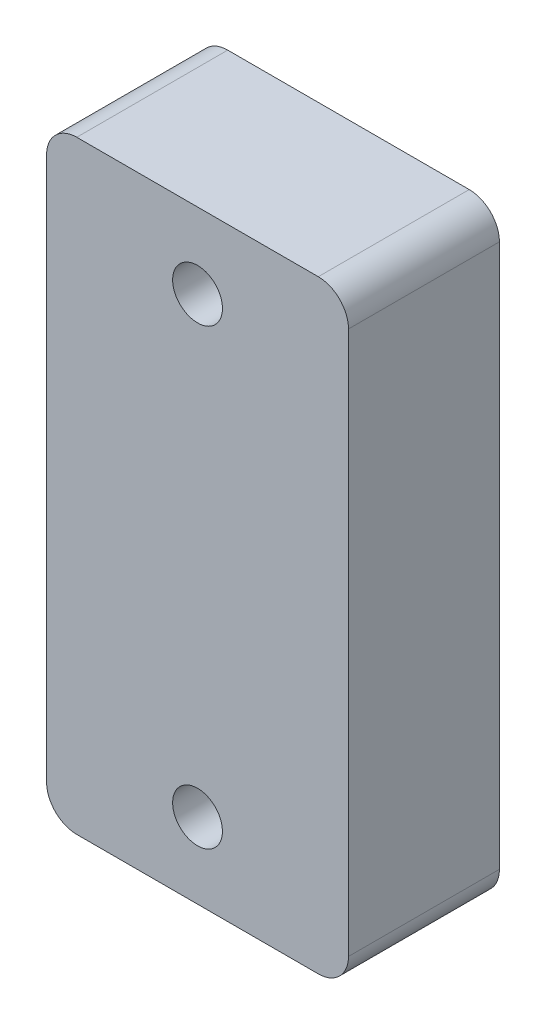
ISO-10303-21;
HEADER;
FILE_DESCRIPTION(('STEP AP214'),'2;1');
FILE_NAME('part.step','',(''),(''),'','','');
FILE_SCHEMA(('AUTOMOTIVE_DESIGN { 1 0 10303 214 1 1 1 1 }'));
ENDSEC;
DATA;
#1=APPLICATION_CONTEXT('core data for automotive mechanical design processes');
#2=APPLICATION_PROTOCOL_DEFINITION('international standard','automotive_design',2000,#1);
#3=PRODUCT_CONTEXT('',#1,'mechanical');
#4=PRODUCT('Part','Part','',(#3));
#5=PRODUCT_RELATED_PRODUCT_CATEGORY('part','',(#4));
#6=PRODUCT_DEFINITION_FORMATION('','',#4);
#7=PRODUCT_DEFINITION_CONTEXT('part definition',#1,'design');
#8=PRODUCT_DEFINITION('design','',#6,#7);
#9=PRODUCT_DEFINITION_SHAPE('','',#8);
#10=(LENGTH_UNIT() NAMED_UNIT(*) SI_UNIT(.MILLI.,.METRE.));
#11=(NAMED_UNIT(*) PLANE_ANGLE_UNIT() SI_UNIT($,.RADIAN.));
#12=(NAMED_UNIT(*) SI_UNIT($,.STERADIAN.) SOLID_ANGLE_UNIT());
#13=UNCERTAINTY_MEASURE_WITH_UNIT(LENGTH_MEASURE(1.E-05),#10,'distance_accuracy_value','');
#14=(GEOMETRIC_REPRESENTATION_CONTEXT(3) GLOBAL_UNCERTAINTY_ASSIGNED_CONTEXT((#13)) GLOBAL_UNIT_ASSIGNED_CONTEXT((#10,
#11,#12)) REPRESENTATION_CONTEXT('',''));
#15=CARTESIAN_POINT('',(0.,0.,0.));
#16=DIRECTION('',(0.,0.,1.));
#17=DIRECTION('',(1.,0.,0.));
#18=AXIS2_PLACEMENT_3D('',#15,#16,#17);
#19=CARTESIAN_POINT('',(0.,0.,10.));
#20=DIRECTION('',(0.,0.,1.));
#21=DIRECTION('',(1.,0.,0.));
#22=AXIS2_PLACEMENT_3D('',#19,#20,#21);
#23=PLANE('',#22);
#24=CARTESIAN_POINT('',(0.,15.,10.));
#25=DIRECTION('',(0.,0.,1.));
#26=DIRECTION('',(1.,0.,0.));
#27=AXIS2_PLACEMENT_3D('',#24,#25,#26);
#28=CIRCLE('',#27,1.65);
#29=CARTESIAN_POINT('',(1.65,15.,10.));
#30=VERTEX_POINT('',#29);
#31=EDGE_CURVE('E135',#30,#30,#28,.T.);
#32=ORIENTED_EDGE('',*,*,#31,.F.);
#33=EDGE_LOOP('',(#32));
#34=FACE_BOUND('',#33,.T.);
#35=DIRECTION('',(1.,0.,0.));
#36=VECTOR('',#35,1.);
#37=CARTESIAN_POINT('',(-9.99999999999999,-20.,10.));
#38=LINE('',#37,#36);
#39=CARTESIAN_POINT('',(-7.99999999999999,-20.,10.));
#40=VERTEX_POINT('',#39);
#41=CARTESIAN_POINT('',(8.00000000000001,-20.,10.));
#42=VERTEX_POINT('',#41);
#43=EDGE_CURVE('E144',#40,#42,#38,.T.);
#44=ORIENTED_EDGE('',*,*,#43,.T.);
#45=CARTESIAN_POINT('',(8.00000000000001,-18.,10.));
#46=DIRECTION('',(0.,0.,1.));
#47=DIRECTION('',(1.,0.,0.));
#48=AXIS2_PLACEMENT_3D('',#45,#46,#47);
#49=CIRCLE('',#48,2.);
#50=CARTESIAN_POINT('',(10.,-18.,10.));
#51=VERTEX_POINT('',#50);
#52=EDGE_CURVE('E163',#42,#51,#49,.T.);
#53=ORIENTED_EDGE('',*,*,#52,.T.);
#54=DIRECTION('',(0.,1.,0.));
#55=VECTOR('',#54,1.);
#56=CARTESIAN_POINT('',(10.,20.,10.));
#57=LINE('',#56,#55);
#58=CARTESIAN_POINT('',(10.,18.,10.));
#59=VERTEX_POINT('',#58);
#60=EDGE_CURVE('E127',#51,#59,#57,.T.);
#61=ORIENTED_EDGE('',*,*,#60,.T.);
#62=CARTESIAN_POINT('',(8.,18.,10.));
#63=DIRECTION('',(0.,0.,1.));
#64=DIRECTION('',(1.,0.,0.));
#65=AXIS2_PLACEMENT_3D('',#62,#63,#64);
#66=CIRCLE('',#65,2.);
#67=CARTESIAN_POINT('',(8.,20.,10.));
#68=VERTEX_POINT('',#67);
#69=EDGE_CURVE('E158',#59,#68,#66,.T.);
#70=ORIENTED_EDGE('',*,*,#69,.T.);
#71=DIRECTION('',(-1.,0.,0.));
#72=VECTOR('',#71,1.);
#73=CARTESIAN_POINT('',(-10.,20.,10.));
#74=LINE('',#73,#72);
#75=CARTESIAN_POINT('',(-8.,20.,10.));
#76=VERTEX_POINT('',#75);
#77=EDGE_CURVE('E174',#68,#76,#74,.T.);
#78=ORIENTED_EDGE('',*,*,#77,.T.);
#79=CARTESIAN_POINT('',(-8.,18.,10.));
#80=DIRECTION('',(0.,0.,1.));
#81=DIRECTION('',(1.,0.,0.));
#82=AXIS2_PLACEMENT_3D('',#79,#80,#81);
#83=CIRCLE('',#82,2.);
#84=CARTESIAN_POINT('',(-10.,18.,10.));
#85=VERTEX_POINT('',#84);
#86=EDGE_CURVE('E63',#76,#85,#83,.T.);
#87=ORIENTED_EDGE('',*,*,#86,.T.);
#88=DIRECTION('',(0.,-1.,0.));
#89=VECTOR('',#88,1.);
#90=CARTESIAN_POINT('',(-10.,20.,10.));
#91=LINE('',#90,#89);
#92=CARTESIAN_POINT('',(-9.99999999999999,-18.,10.));
#93=VERTEX_POINT('',#92);
#94=EDGE_CURVE('E182',#85,#93,#91,.T.);
#95=ORIENTED_EDGE('',*,*,#94,.T.);
#96=CARTESIAN_POINT('',(-7.99999999999999,-18.,10.));
#97=DIRECTION('',(0.,0.,1.));
#98=DIRECTION('',(1.,0.,0.));
#99=AXIS2_PLACEMENT_3D('',#96,#97,#98);
#100=CIRCLE('',#99,2.);
#101=EDGE_CURVE('E161',#93,#40,#100,.T.);
#102=ORIENTED_EDGE('',*,*,#101,.T.);
#103=EDGE_LOOP('',(#44,#53,#61,#70,#78,#87,#95,#102));
#104=FACE_BOUND('',#103,.T.);
#105=CARTESIAN_POINT('',(0.,-15.,10.));
#106=DIRECTION('',(0.,0.,1.));
#107=DIRECTION('',(-1.,0.,0.));
#108=AXIS2_PLACEMENT_3D('',#105,#106,#107);
#109=CIRCLE('',#108,1.65);
#110=CARTESIAN_POINT('',(-1.65,-15.,10.));
#111=VERTEX_POINT('',#110);
#112=EDGE_CURVE('E189',#111,#111,#109,.T.);
#113=ORIENTED_EDGE('',*,*,#112,.F.);
#114=EDGE_LOOP('',(#113));
#115=FACE_BOUND('',#114,.T.);
#116=ADVANCED_FACE('F41',(#34,#104,#115),#23,.T.);
#117=CARTESIAN_POINT('',(0.,0.,0.));
#118=DIRECTION('',(0.,0.,1.));
#119=DIRECTION('',(1.,0.,0.));
#120=AXIS2_PLACEMENT_3D('',#117,#118,#119);
#121=PLANE('',#120);
#122=DIRECTION('',(0.,1.,0.));
#123=VECTOR('',#122,1.);
#124=CARTESIAN_POINT('',(10.,20.,0.));
#125=LINE('',#124,#123);
#126=CARTESIAN_POINT('',(10.,-18.,0.));
#127=VERTEX_POINT('',#126);
#128=CARTESIAN_POINT('',(10.,18.,0.));
#129=VERTEX_POINT('',#128);
#130=EDGE_CURVE('E124',#127,#129,#125,.T.);
#131=ORIENTED_EDGE('',*,*,#130,.F.);
#132=CARTESIAN_POINT('',(8.00000000000001,-18.,0.));
#133=DIRECTION('',(0.,0.,1.));
#134=DIRECTION('',(1.,0.,0.));
#135=AXIS2_PLACEMENT_3D('',#132,#133,#134);
#136=CIRCLE('',#135,2.);
#137=CARTESIAN_POINT('',(8.00000000000001,-20.,0.));
#138=VERTEX_POINT('',#137);
#139=EDGE_CURVE('E107',#127,#138,#136,.F.);
#140=ORIENTED_EDGE('',*,*,#139,.T.);
#141=DIRECTION('',(1.,0.,0.));
#142=VECTOR('',#141,1.);
#143=CARTESIAN_POINT('',(-9.99999999999999,-20.,0.));
#144=LINE('',#143,#142);
#145=CARTESIAN_POINT('',(-7.99999999999999,-20.,0.));
#146=VERTEX_POINT('',#145);
#147=EDGE_CURVE('E148',#146,#138,#144,.T.);
#148=ORIENTED_EDGE('',*,*,#147,.F.);
#149=CARTESIAN_POINT('',(-7.99999999999999,-18.,0.));
#150=DIRECTION('',(0.,0.,1.));
#151=DIRECTION('',(1.,0.,0.));
#152=AXIS2_PLACEMENT_3D('',#149,#150,#151);
#153=CIRCLE('',#152,2.);
#154=CARTESIAN_POINT('',(-9.99999999999999,-18.,0.));
#155=VERTEX_POINT('',#154);
#156=EDGE_CURVE('E118',#146,#155,#153,.F.);
#157=ORIENTED_EDGE('',*,*,#156,.T.);
#158=DIRECTION('',(0.,-1.,0.));
#159=VECTOR('',#158,1.);
#160=CARTESIAN_POINT('',(-10.,20.,0.));
#161=LINE('',#160,#159);
#162=CARTESIAN_POINT('',(-10.,18.,0.));
#163=VERTEX_POINT('',#162);
#164=EDGE_CURVE('E138',#163,#155,#161,.T.);
#165=ORIENTED_EDGE('',*,*,#164,.F.);
#166=CARTESIAN_POINT('',(-8.,18.,0.));
#167=DIRECTION('',(0.,0.,1.));
#168=DIRECTION('',(1.,0.,0.));
#169=AXIS2_PLACEMENT_3D('',#166,#167,#168);
#170=CIRCLE('',#169,2.);
#171=CARTESIAN_POINT('',(-8.,20.,0.));
#172=VERTEX_POINT('',#171);
#173=EDGE_CURVE('E152',#163,#172,#170,.F.);
#174=ORIENTED_EDGE('',*,*,#173,.T.);
#175=DIRECTION('',(-1.,0.,0.));
#176=VECTOR('',#175,1.);
#177=CARTESIAN_POINT('',(-10.,20.,0.));
#178=LINE('',#177,#176);
#179=CARTESIAN_POINT('',(8.,20.,0.));
#180=VERTEX_POINT('',#179);
#181=EDGE_CURVE('E134',#180,#172,#178,.T.);
#182=ORIENTED_EDGE('',*,*,#181,.F.);
#183=CARTESIAN_POINT('',(8.,18.,0.));
#184=DIRECTION('',(0.,0.,1.));
#185=DIRECTION('',(1.,0.,0.));
#186=AXIS2_PLACEMENT_3D('',#183,#184,#185);
#187=CIRCLE('',#186,2.);
#188=EDGE_CURVE('E128',#180,#129,#187,.F.);
#189=ORIENTED_EDGE('',*,*,#188,.T.);
#190=EDGE_LOOP('',(#131,#140,#148,#157,#165,#174,#182,#189));
#191=FACE_BOUND('',#190,.T.);
#192=CARTESIAN_POINT('',(0.,15.,0.));
#193=DIRECTION('',(0.,0.,1.));
#194=DIRECTION('',(1.,0.,0.));
#195=AXIS2_PLACEMENT_3D('',#192,#193,#194);
#196=CIRCLE('',#195,1.65);
#197=CARTESIAN_POINT('',(1.65,15.,0.));
#198=VERTEX_POINT('',#197);
#199=EDGE_CURVE('E141',#198,#198,#196,.T.);
#200=ORIENTED_EDGE('',*,*,#199,.T.);
#201=EDGE_LOOP('',(#200));
#202=FACE_BOUND('',#201,.T.);
#203=CARTESIAN_POINT('',(0.,-15.,0.));
#204=DIRECTION('',(0.,0.,1.));
#205=DIRECTION('',(-1.,0.,0.));
#206=AXIS2_PLACEMENT_3D('',#203,#204,#205);
#207=CIRCLE('',#206,1.65);
#208=CARTESIAN_POINT('',(-1.65,-15.,0.));
#209=VERTEX_POINT('',#208);
#210=EDGE_CURVE('E191',#209,#209,#207,.T.);
#211=ORIENTED_EDGE('',*,*,#210,.T.);
#212=EDGE_LOOP('',(#211));
#213=FACE_BOUND('',#212,.T.);
#214=ADVANCED_FACE('F131',(#191,#202,#213),#121,.F.);
#215=CARTESIAN_POINT('',(10.,20.,10.));
#216=DIRECTION('',(-1.,0.,0.));
#217=DIRECTION('',(0.,-1.,0.));
#218=AXIS2_PLACEMENT_3D('',#215,#216,#217);
#219=PLANE('',#218);
#220=ORIENTED_EDGE('',*,*,#60,.F.);
#221=DIRECTION('',(0.,0.,-1.));
#222=VECTOR('',#221,1.);
#223=CARTESIAN_POINT('',(10.,-18.,10.));
#224=LINE('',#223,#222);
#225=EDGE_CURVE('E111',#51,#127,#224,.T.);
#226=ORIENTED_EDGE('',*,*,#225,.T.);
#227=ORIENTED_EDGE('',*,*,#130,.T.);
#228=DIRECTION('',(0.,0.,-1.));
#229=VECTOR('',#228,1.);
#230=CARTESIAN_POINT('',(10.,18.,10.));
#231=LINE('',#230,#229);
#232=EDGE_CURVE('E129',#129,#59,#231,.F.);
#233=ORIENTED_EDGE('',*,*,#232,.T.);
#234=EDGE_LOOP('',(#220,#226,#227,#233));
#235=FACE_BOUND('',#234,.T.);
#236=ADVANCED_FACE('F123',(#235),#219,.F.);
#237=CARTESIAN_POINT('',(-10.,20.,10.));
#238=DIRECTION('',(0.,-1.,0.));
#239=DIRECTION('',(0.,0.,-1.));
#240=AXIS2_PLACEMENT_3D('',#237,#238,#239);
#241=PLANE('',#240);
#242=ORIENTED_EDGE('',*,*,#181,.T.);
#243=DIRECTION('',(0.,0.,-1.));
#244=VECTOR('',#243,1.);
#245=CARTESIAN_POINT('',(-8.,20.,10.));
#246=LINE('',#245,#244);
#247=EDGE_CURVE('E11',#172,#76,#246,.F.);
#248=ORIENTED_EDGE('',*,*,#247,.T.);
#249=ORIENTED_EDGE('',*,*,#77,.F.);
#250=DIRECTION('',(0.,0.,-1.));
#251=VECTOR('',#250,1.);
#252=CARTESIAN_POINT('',(8.,20.,10.));
#253=LINE('',#252,#251);
#254=EDGE_CURVE('E49',#68,#180,#253,.T.);
#255=ORIENTED_EDGE('',*,*,#254,.T.);
#256=EDGE_LOOP('',(#242,#248,#249,#255));
#257=FACE_BOUND('',#256,.T.);
#258=ADVANCED_FACE('F172',(#257),#241,.F.);
#259=CARTESIAN_POINT('',(-10.,20.,10.));
#260=DIRECTION('',(1.,0.,0.));
#261=DIRECTION('',(0.,1.,0.));
#262=AXIS2_PLACEMENT_3D('',#259,#260,#261);
#263=PLANE('',#262);
#264=ORIENTED_EDGE('',*,*,#164,.T.);
#265=DIRECTION('',(0.,0.,-1.));
#266=VECTOR('',#265,1.);
#267=CARTESIAN_POINT('',(-9.99999999999999,-18.,10.));
#268=LINE('',#267,#266);
#269=EDGE_CURVE('E56',#155,#93,#268,.F.);
#270=ORIENTED_EDGE('',*,*,#269,.T.);
#271=ORIENTED_EDGE('',*,*,#94,.F.);
#272=DIRECTION('',(0.,0.,-1.));
#273=VECTOR('',#272,1.);
#274=CARTESIAN_POINT('',(-10.,18.,10.));
#275=LINE('',#274,#273);
#276=EDGE_CURVE('E165',#85,#163,#275,.T.);
#277=ORIENTED_EDGE('',*,*,#276,.T.);
#278=EDGE_LOOP('',(#264,#270,#271,#277));
#279=FACE_BOUND('',#278,.T.);
#280=ADVANCED_FACE('F181',(#279),#263,.F.);
#281=CARTESIAN_POINT('',(-9.99999999999999,-20.,10.));
#282=DIRECTION('',(0.,1.,0.));
#283=DIRECTION('',(0.,0.,1.));
#284=AXIS2_PLACEMENT_3D('',#281,#282,#283);
#285=PLANE('',#284);
#286=ORIENTED_EDGE('',*,*,#147,.T.);
#287=DIRECTION('',(0.,0.,-1.));
#288=VECTOR('',#287,1.);
#289=CARTESIAN_POINT('',(8.00000000000001,-20.,10.));
#290=LINE('',#289,#288);
#291=EDGE_CURVE('E112',#138,#42,#290,.F.);
#292=ORIENTED_EDGE('',*,*,#291,.T.);
#293=ORIENTED_EDGE('',*,*,#43,.F.);
#294=DIRECTION('',(0.,0.,-1.));
#295=VECTOR('',#294,1.);
#296=CARTESIAN_POINT('',(-7.99999999999999,-20.,10.));
#297=LINE('',#296,#295);
#298=EDGE_CURVE('E117',#40,#146,#297,.T.);
#299=ORIENTED_EDGE('',*,*,#298,.T.);
#300=EDGE_LOOP('',(#286,#292,#293,#299));
#301=FACE_BOUND('',#300,.T.);
#302=ADVANCED_FACE('F213',(#301),#285,.F.);
#303=CARTESIAN_POINT('',(0.,15.,10.));
#304=DIRECTION('',(0.,0.,-1.));
#305=DIRECTION('',(-1.,0.,0.));
#306=AXIS2_PLACEMENT_3D('',#303,#304,#305);
#307=CYLINDRICAL_SURFACE('',#306,1.65);
#308=ORIENTED_EDGE('',*,*,#31,.T.);
#309=EDGE_LOOP('',(#308));
#310=FACE_BOUND('',#309,.T.);
#311=ORIENTED_EDGE('',*,*,#199,.F.);
#312=EDGE_LOOP('',(#311));
#313=FACE_BOUND('',#312,.T.);
#314=ADVANCED_FACE('F210',(#310,#313),#307,.F.);
#315=CARTESIAN_POINT('',(0.,-15.,10.));
#316=DIRECTION('',(0.,0.,-1.));
#317=DIRECTION('',(-1.,0.,0.));
#318=AXIS2_PLACEMENT_3D('',#315,#316,#317);
#319=CYLINDRICAL_SURFACE('',#318,1.65);
#320=ORIENTED_EDGE('',*,*,#112,.T.);
#321=EDGE_LOOP('',(#320));
#322=FACE_BOUND('',#321,.T.);
#323=ORIENTED_EDGE('',*,*,#210,.F.);
#324=EDGE_LOOP('',(#323));
#325=FACE_BOUND('',#324,.T.);
#326=ADVANCED_FACE('F197',(#322,#325),#319,.F.);
#327=CARTESIAN_POINT('',(8.00000000000001,-18.,10.));
#328=DIRECTION('',(0.,0.,-1.));
#329=DIRECTION('',(-1.,0.,0.));
#330=AXIS2_PLACEMENT_3D('',#327,#328,#329);
#331=CYLINDRICAL_SURFACE('',#330,2.);
#332=ORIENTED_EDGE('',*,*,#52,.F.);
#333=ORIENTED_EDGE('',*,*,#291,.F.);
#334=ORIENTED_EDGE('',*,*,#139,.F.);
#335=ORIENTED_EDGE('',*,*,#225,.F.);
#336=EDGE_LOOP('',(#332,#333,#334,#335));
#337=FACE_BOUND('',#336,.T.);
#338=ADVANCED_FACE('F110',(#337),#331,.T.);
#339=CARTESIAN_POINT('',(-7.99999999999999,-18.,10.));
#340=DIRECTION('',(0.,0.,-1.));
#341=DIRECTION('',(-1.,0.,0.));
#342=AXIS2_PLACEMENT_3D('',#339,#340,#341);
#343=CYLINDRICAL_SURFACE('',#342,2.);
#344=ORIENTED_EDGE('',*,*,#101,.F.);
#345=ORIENTED_EDGE('',*,*,#269,.F.);
#346=ORIENTED_EDGE('',*,*,#156,.F.);
#347=ORIENTED_EDGE('',*,*,#298,.F.);
#348=EDGE_LOOP('',(#344,#345,#346,#347));
#349=FACE_BOUND('',#348,.T.);
#350=ADVANCED_FACE('F225',(#349),#343,.T.);
#351=CARTESIAN_POINT('',(-8.,18.,10.));
#352=DIRECTION('',(0.,0.,-1.));
#353=DIRECTION('',(-1.,0.,0.));
#354=AXIS2_PLACEMENT_3D('',#351,#352,#353);
#355=CYLINDRICAL_SURFACE('',#354,2.);
#356=ORIENTED_EDGE('',*,*,#86,.F.);
#357=ORIENTED_EDGE('',*,*,#247,.F.);
#358=ORIENTED_EDGE('',*,*,#173,.F.);
#359=ORIENTED_EDGE('',*,*,#276,.F.);
#360=EDGE_LOOP('',(#356,#357,#358,#359));
#361=FACE_BOUND('',#360,.T.);
#362=ADVANCED_FACE('F180',(#361),#355,.T.);
#363=CARTESIAN_POINT('',(8.,18.,10.));
#364=DIRECTION('',(0.,0.,-1.));
#365=DIRECTION('',(-1.,0.,0.));
#366=AXIS2_PLACEMENT_3D('',#363,#364,#365);
#367=CYLINDRICAL_SURFACE('',#366,2.);
#368=ORIENTED_EDGE('',*,*,#69,.F.);
#369=ORIENTED_EDGE('',*,*,#232,.F.);
#370=ORIENTED_EDGE('',*,*,#188,.F.);
#371=ORIENTED_EDGE('',*,*,#254,.F.);
#372=EDGE_LOOP('',(#368,#369,#370,#371));
#373=FACE_BOUND('',#372,.T.);
#374=ADVANCED_FACE('F43',(#373),#367,.T.);
#375=CLOSED_SHELL('',(#116,#214,#236,#258,#280,#302,#314,#326,#338,#350,#362,#374));
#376=MANIFOLD_SOLID_BREP('B2',#375);
#377=ADVANCED_BREP_SHAPE_REPRESENTATION('',(#18,#376),#14);
#378=SHAPE_DEFINITION_REPRESENTATION(#9,#377);
ENDSEC;
END-ISO-10303-21;
